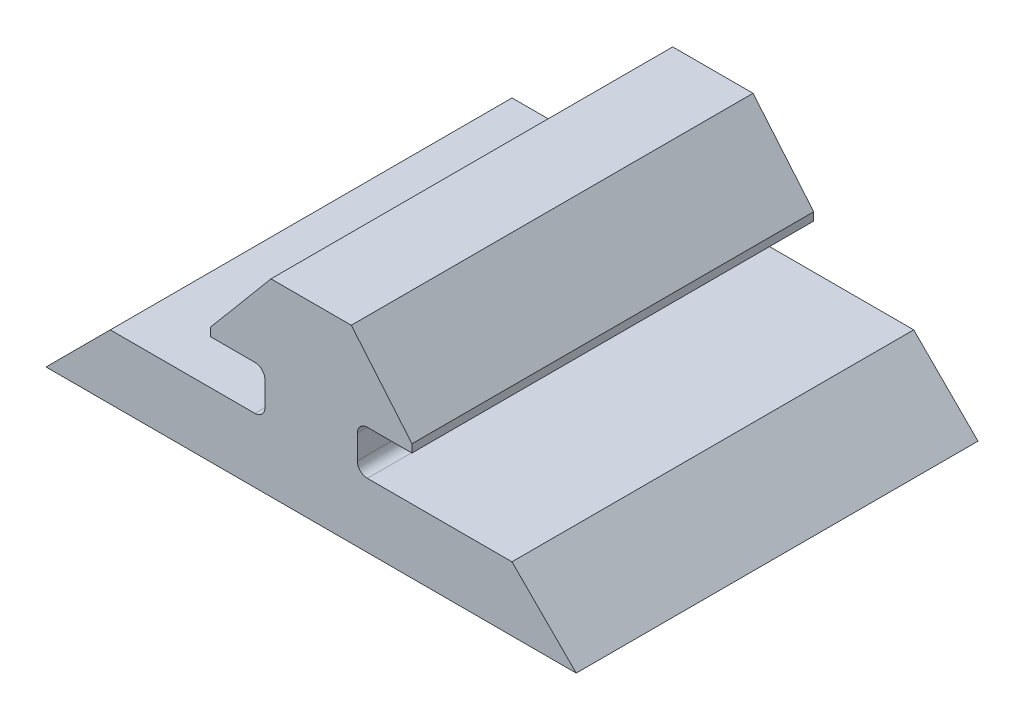
ISO-10303-21;
HEADER;
FILE_DESCRIPTION(('STEP AP214'),'2;1');
FILE_NAME('part.step','',(''),(''),'','','');
FILE_SCHEMA(('AUTOMOTIVE_DESIGN { 1 0 10303 214 1 1 1 1 }'));
ENDSEC;
DATA;
#1=APPLICATION_CONTEXT('core data for automotive mechanical design processes');
#2=APPLICATION_PROTOCOL_DEFINITION('international standard','automotive_design',2000,#1);
#3=PRODUCT_CONTEXT('',#1,'mechanical');
#4=PRODUCT('Part','Part','',(#3));
#5=PRODUCT_RELATED_PRODUCT_CATEGORY('part','',(#4));
#6=PRODUCT_DEFINITION_FORMATION('','',#4);
#7=PRODUCT_DEFINITION_CONTEXT('part definition',#1,'design');
#8=PRODUCT_DEFINITION('design','',#6,#7);
#9=PRODUCT_DEFINITION_SHAPE('','',#8);
#10=(LENGTH_UNIT() NAMED_UNIT(*) SI_UNIT(.MILLI.,.METRE.));
#11=(NAMED_UNIT(*) PLANE_ANGLE_UNIT() SI_UNIT($,.RADIAN.));
#12=(NAMED_UNIT(*) SI_UNIT($,.STERADIAN.) SOLID_ANGLE_UNIT());
#13=UNCERTAINTY_MEASURE_WITH_UNIT(LENGTH_MEASURE(1.E-05),#10,'distance_accuracy_value','');
#14=(GEOMETRIC_REPRESENTATION_CONTEXT(3) GLOBAL_UNCERTAINTY_ASSIGNED_CONTEXT((#13)) GLOBAL_UNIT_ASSIGNED_CONTEXT((#10,
#11,#12)) REPRESENTATION_CONTEXT('',''));
#15=CARTESIAN_POINT('',(0.,0.,0.));
#16=DIRECTION('',(0.,0.,1.));
#17=DIRECTION('',(1.,0.,0.));
#18=AXIS2_PLACEMENT_3D('',#15,#16,#17);
#19=CARTESIAN_POINT('',(12.7,0.,4.44089209850063E-13));
#20=DIRECTION('',(0.,-1.,0.));
#21=DIRECTION('',(0.,0.,-1.));
#22=AXIS2_PLACEMENT_3D('',#19,#20,#21);
#23=PLANE('',#22);
#24=DIRECTION('',(-1.,0.,0.));
#25=VECTOR('',#24,1.);
#26=CARTESIAN_POINT('',(12.7,0.,-25.4031625000229));
#27=LINE('',#26,#25);
#28=CARTESIAN_POINT('',(16.7640000000001,0.,-25.4031625000229));
#29=VERTEX_POINT('',#28);
#30=CARTESIAN_POINT('',(-16.7639999999999,0.,-25.4031625000229));
#31=VERTEX_POINT('',#30);
#32=EDGE_CURVE('E49',#29,#31,#27,.T.);
#33=ORIENTED_EDGE('',*,*,#32,.F.);
#34=DIRECTION('',(0.,0.,1.));
#35=VECTOR('',#34,1.);
#36=CARTESIAN_POINT('',(16.7640000000001,0.,-50.8000000000001));
#37=LINE('',#36,#35);
#38=CARTESIAN_POINT('',(16.7640000000001,0.,0.));
#39=VERTEX_POINT('',#38);
#40=EDGE_CURVE('E168',#29,#39,#37,.T.);
#41=ORIENTED_EDGE('',*,*,#40,.T.);
#42=DIRECTION('',(-1.,0.,0.));
#43=VECTOR('',#42,1.);
#44=CARTESIAN_POINT('',(12.7,0.,4.44089209850063E-13));
#45=LINE('',#44,#43);
#46=CARTESIAN_POINT('',(-16.7639999999999,0.,0.));
#47=VERTEX_POINT('',#46);
#48=EDGE_CURVE('E228',#39,#47,#45,.T.);
#49=ORIENTED_EDGE('',*,*,#48,.T.);
#50=DIRECTION('',(0.,0.,1.));
#51=VECTOR('',#50,1.);
#52=CARTESIAN_POINT('',(-16.7639999999999,0.,-50.8000000000001));
#53=LINE('',#52,#51);
#54=EDGE_CURVE('E170',#31,#47,#53,.T.);
#55=ORIENTED_EDGE('',*,*,#54,.F.);
#56=EDGE_LOOP('',(#33,#41,#49,#55));
#57=FACE_BOUND('',#56,.T.);
#58=ADVANCED_FACE('F35',(#57),#23,.T.);
#59=CARTESIAN_POINT('',(3.55599999999985,4.06399999999999,4.44089209850063E-13));
#60=DIRECTION('',(0.,1.,0.));
#61=DIRECTION('',(-1.,0.,0.));
#62=AXIS2_PLACEMENT_3D('',#59,#60,#61);
#63=PLANE('',#62);
#64=DIRECTION('',(1.,0.,0.));
#65=VECTOR('',#64,1.);
#66=CARTESIAN_POINT('',(3.55599999999985,4.06399999999999,-25.4031625000229));
#67=LINE('',#66,#65);
#68=CARTESIAN_POINT('',(3.55599999999985,4.06399999999999,-25.4031625000229));
#69=VERTEX_POINT('',#68);
#70=CARTESIAN_POINT('',(12.7,4.064,-25.4031625000229));
#71=VERTEX_POINT('',#70);
#72=EDGE_CURVE('E160',#69,#71,#67,.T.);
#73=ORIENTED_EDGE('',*,*,#72,.F.);
#74=DIRECTION('',(0.,0.,-1.));
#75=VECTOR('',#74,1.);
#76=CARTESIAN_POINT('',(3.55599999999985,4.064,4.44089209850063E-13));
#77=LINE('',#76,#75);
#78=CARTESIAN_POINT('',(3.55599999999985,4.064,4.44089209850063E-13));
#79=VERTEX_POINT('',#78);
#80=EDGE_CURVE('E43',#79,#69,#77,.T.);
#81=ORIENTED_EDGE('',*,*,#80,.F.);
#82=DIRECTION('',(1.,0.,0.));
#83=VECTOR('',#82,1.);
#84=CARTESIAN_POINT('',(3.55599999999985,4.06399999999999,4.44089209850063E-13));
#85=LINE('',#84,#83);
#86=CARTESIAN_POINT('',(12.7,4.064,0.));
#87=VERTEX_POINT('',#86);
#88=EDGE_CURVE('E226',#79,#87,#85,.T.);
#89=ORIENTED_EDGE('',*,*,#88,.T.);
#90=DIRECTION('',(0.,0.,1.));
#91=VECTOR('',#90,1.);
#92=CARTESIAN_POINT('',(12.7,4.064,-50.8000000000001));
#93=LINE('',#92,#91);
#94=EDGE_CURVE('E177',#71,#87,#93,.T.);
#95=ORIENTED_EDGE('',*,*,#94,.F.);
#96=EDGE_LOOP('',(#73,#81,#89,#95));
#97=FACE_BOUND('',#96,.T.);
#98=ADVANCED_FACE('F361',(#97),#63,.T.);
#99=CARTESIAN_POINT('',(3.55599999999985,4.69899999999985,4.44089209850063E-13));
#100=DIRECTION('',(0.,0.,-1.));
#101=DIRECTION('',(-1.,0.,0.));
#102=AXIS2_PLACEMENT_3D('',#99,#100,#101);
#103=CYLINDRICAL_SURFACE('',#102,0.634999999999851);
#104=CARTESIAN_POINT('',(3.55599999999985,4.69899999999985,-25.4031625000229));
#105=DIRECTION('',(0.,0.,1.));
#106=DIRECTION('',(1.,0.,0.));
#107=AXIS2_PLACEMENT_3D('',#104,#105,#106);
#108=CIRCLE('',#107,0.634999999999851);
#109=CARTESIAN_POINT('',(2.921,4.69899999999985,-25.4031625000229));
#110=VERTEX_POINT('',#109);
#111=EDGE_CURVE('E303',#110,#69,#108,.T.);
#112=ORIENTED_EDGE('',*,*,#111,.F.);
#113=DIRECTION('',(0.,0.,-1.));
#114=VECTOR('',#113,1.);
#115=CARTESIAN_POINT('',(2.921,4.69899999999985,4.44089209850063E-13));
#116=LINE('',#115,#114);
#117=CARTESIAN_POINT('',(2.921,4.69899999999985,4.44089209850063E-13));
#118=VERTEX_POINT('',#117);
#119=EDGE_CURVE('E232',#118,#110,#116,.T.);
#120=ORIENTED_EDGE('',*,*,#119,.F.);
#121=CARTESIAN_POINT('',(3.55599999999985,4.69899999999985,4.44089209850063E-13));
#122=DIRECTION('',(0.,0.,1.));
#123=DIRECTION('',(1.,0.,0.));
#124=AXIS2_PLACEMENT_3D('',#121,#122,#123);
#125=CIRCLE('',#124,0.634999999999851);
#126=EDGE_CURVE('E223',#118,#79,#125,.T.);
#127=ORIENTED_EDGE('',*,*,#126,.T.);
#128=ORIENTED_EDGE('',*,*,#80,.T.);
#129=EDGE_LOOP('',(#112,#120,#127,#128));
#130=FACE_BOUND('',#129,.T.);
#131=ADVANCED_FACE('F322',(#130),#103,.F.);
#132=CARTESIAN_POINT('',(2.92099999999999,6.22300000000015,4.44089209850063E-13));
#133=DIRECTION('',(1.,0.,0.));
#134=DIRECTION('',(0.,1.,0.));
#135=AXIS2_PLACEMENT_3D('',#132,#133,#134);
#136=PLANE('',#135);
#137=DIRECTION('',(0.,-1.,0.));
#138=VECTOR('',#137,1.);
#139=CARTESIAN_POINT('',(2.92099999999999,6.22300000000015,-25.4031625000229));
#140=LINE('',#139,#138);
#141=CARTESIAN_POINT('',(2.92099999999999,6.22300000000015,-25.4031625000229));
#142=VERTEX_POINT('',#141);
#143=EDGE_CURVE('E305',#142,#110,#140,.T.);
#144=ORIENTED_EDGE('',*,*,#143,.F.);
#145=DIRECTION('',(0.,0.,-1.));
#146=VECTOR('',#145,1.);
#147=CARTESIAN_POINT('',(2.921,6.22300000000015,4.44089209850063E-13));
#148=LINE('',#147,#146);
#149=CARTESIAN_POINT('',(2.921,6.22300000000015,4.44089209850063E-13));
#150=VERTEX_POINT('',#149);
#151=EDGE_CURVE('E235',#150,#142,#148,.T.);
#152=ORIENTED_EDGE('',*,*,#151,.F.);
#153=DIRECTION('',(0.,-1.,0.));
#154=VECTOR('',#153,1.);
#155=CARTESIAN_POINT('',(2.92099999999999,6.22300000000015,4.44089209850063E-13));
#156=LINE('',#155,#154);
#157=EDGE_CURVE('E220',#150,#118,#156,.T.);
#158=ORIENTED_EDGE('',*,*,#157,.T.);
#159=ORIENTED_EDGE('',*,*,#119,.T.);
#160=EDGE_LOOP('',(#144,#152,#158,#159));
#161=FACE_BOUND('',#160,.T.);
#162=ADVANCED_FACE('F325',(#161),#136,.T.);
#163=CARTESIAN_POINT('',(3.55599999999985,6.22300000000015,4.44089209850063E-13));
#164=DIRECTION('',(0.,0.,-1.));
#165=DIRECTION('',(-1.,0.,0.));
#166=AXIS2_PLACEMENT_3D('',#163,#164,#165);
#167=CYLINDRICAL_SURFACE('',#166,0.634999999999851);
#168=CARTESIAN_POINT('',(3.55599999999985,6.22300000000015,-25.4031625000229));
#169=DIRECTION('',(0.,0.,1.));
#170=DIRECTION('',(1.,0.,0.));
#171=AXIS2_PLACEMENT_3D('',#168,#169,#170);
#172=CIRCLE('',#171,0.634999999999851);
#173=CARTESIAN_POINT('',(3.55599999999985,6.858,-25.4031625000229));
#174=VERTEX_POINT('',#173);
#175=EDGE_CURVE('E307',#174,#142,#172,.T.);
#176=ORIENTED_EDGE('',*,*,#175,.F.);
#177=DIRECTION('',(0.,0.,-1.));
#178=VECTOR('',#177,1.);
#179=CARTESIAN_POINT('',(3.55599999999985,6.858,4.44089209850063E-13));
#180=LINE('',#179,#178);
#181=CARTESIAN_POINT('',(3.55599999999985,6.858,4.44089209850063E-13));
#182=VERTEX_POINT('',#181);
#183=EDGE_CURVE('E238',#182,#174,#180,.T.);
#184=ORIENTED_EDGE('',*,*,#183,.F.);
#185=CARTESIAN_POINT('',(3.55599999999985,6.22300000000015,4.44089209850063E-13));
#186=DIRECTION('',(0.,0.,1.));
#187=DIRECTION('',(1.,0.,0.));
#188=AXIS2_PLACEMENT_3D('',#185,#186,#187);
#189=CIRCLE('',#188,0.634999999999851);
#190=EDGE_CURVE('E217',#182,#150,#189,.T.);
#191=ORIENTED_EDGE('',*,*,#190,.T.);
#192=ORIENTED_EDGE('',*,*,#151,.T.);
#193=EDGE_LOOP('',(#176,#184,#191,#192));
#194=FACE_BOUND('',#193,.T.);
#195=ADVANCED_FACE('F330',(#194),#167,.F.);
#196=CARTESIAN_POINT('',(6.376363549,6.858,4.44089209850063E-13));
#197=DIRECTION('',(0.,-1.,0.));
#198=DIRECTION('',(0.,0.,-1.));
#199=AXIS2_PLACEMENT_3D('',#196,#197,#198);
#200=PLANE('',#199);
#201=DIRECTION('',(-1.,0.,0.));
#202=VECTOR('',#201,1.);
#203=CARTESIAN_POINT('',(6.376363549,6.858,-25.4031625000229));
#204=LINE('',#203,#202);
#205=CARTESIAN_POINT('',(6.376363549,6.858,-25.4031625000229));
#206=VERTEX_POINT('',#205);
#207=EDGE_CURVE('E309',#206,#174,#204,.T.);
#208=ORIENTED_EDGE('',*,*,#207,.F.);
#209=DIRECTION('',(0.,0.,-1.));
#210=VECTOR('',#209,1.);
#211=CARTESIAN_POINT('',(6.376363549,6.858,4.44089209850063E-13));
#212=LINE('',#211,#210);
#213=CARTESIAN_POINT('',(6.376363549,6.858,4.44089209850063E-13));
#214=VERTEX_POINT('',#213);
#215=EDGE_CURVE('E241',#214,#206,#212,.T.);
#216=ORIENTED_EDGE('',*,*,#215,.F.);
#217=DIRECTION('',(-1.,0.,0.));
#218=VECTOR('',#217,1.);
#219=CARTESIAN_POINT('',(6.376363549,6.858,4.44089209850063E-13));
#220=LINE('',#219,#218);
#221=EDGE_CURVE('E214',#214,#182,#220,.T.);
#222=ORIENTED_EDGE('',*,*,#221,.T.);
#223=ORIENTED_EDGE('',*,*,#183,.T.);
#224=EDGE_LOOP('',(#208,#216,#222,#223));
#225=FACE_BOUND('',#224,.T.);
#226=ADVANCED_FACE('F333',(#225),#200,.T.);
#227=CARTESIAN_POINT('',(6.376363549,7.36599995798179,4.44089209850063E-13));
#228=DIRECTION('',(1.,0.,0.));
#229=DIRECTION('',(0.,0.,-1.));
#230=AXIS2_PLACEMENT_3D('',#227,#228,#229);
#231=PLANE('',#230);
#232=DIRECTION('',(0.,-1.,0.));
#233=VECTOR('',#232,1.);
#234=CARTESIAN_POINT('',(6.376363549,7.36599995798179,-25.4031625000229));
#235=LINE('',#234,#233);
#236=CARTESIAN_POINT('',(6.376363549,7.36599995798179,-25.4031625000229));
#237=VERTEX_POINT('',#236);
#238=EDGE_CURVE('E311',#237,#206,#235,.T.);
#239=ORIENTED_EDGE('',*,*,#238,.F.);
#240=DIRECTION('',(0.,0.,-1.));
#241=VECTOR('',#240,1.);
#242=CARTESIAN_POINT('',(6.376363549,7.36599995798179,4.44089209850063E-13));
#243=LINE('',#242,#241);
#244=CARTESIAN_POINT('',(6.376363549,7.36599995798179,4.44089209850063E-13));
#245=VERTEX_POINT('',#244);
#246=EDGE_CURVE('E244',#245,#237,#243,.T.);
#247=ORIENTED_EDGE('',*,*,#246,.F.);
#248=DIRECTION('',(0.,-1.,0.));
#249=VECTOR('',#248,1.);
#250=CARTESIAN_POINT('',(6.376363549,7.36599995798179,4.44089209850063E-13));
#251=LINE('',#250,#249);
#252=EDGE_CURVE('E211',#245,#214,#251,.T.);
#253=ORIENTED_EDGE('',*,*,#252,.T.);
#254=ORIENTED_EDGE('',*,*,#215,.T.);
#255=EDGE_LOOP('',(#239,#247,#253,#254));
#256=FACE_BOUND('',#255,.T.);
#257=ADVANCED_FACE('F338',(#256),#231,.T.);
#258=CARTESIAN_POINT('',(2.54,11.938,4.44089209850063E-13));
#259=DIRECTION('',(0.766044443118977,0.642787609686541,0.));
#260=DIRECTION('',(-0.642787609686541,0.766044443118977,0.));
#261=AXIS2_PLACEMENT_3D('',#258,#259,#260);
#262=PLANE('',#261);
#263=DIRECTION('',(0.642787609686541,-0.766044443118977,0.));
#264=VECTOR('',#263,1.);
#265=CARTESIAN_POINT('',(2.54,11.938,-25.4031625000229));
#266=LINE('',#265,#264);
#267=CARTESIAN_POINT('',(2.54,11.938,-25.4031625000229));
#268=VERTEX_POINT('',#267);
#269=EDGE_CURVE('E313',#268,#237,#266,.T.);
#270=ORIENTED_EDGE('',*,*,#269,.F.);
#271=DIRECTION('',(0.,0.,-1.));
#272=VECTOR('',#271,1.);
#273=CARTESIAN_POINT('',(2.54,11.938,4.44089209850063E-13));
#274=LINE('',#273,#272);
#275=CARTESIAN_POINT('',(2.54,11.938,4.44089209850063E-13));
#276=VERTEX_POINT('',#275);
#277=EDGE_CURVE('E247',#276,#268,#274,.T.);
#278=ORIENTED_EDGE('',*,*,#277,.F.);
#279=DIRECTION('',(0.642787609686541,-0.766044443118977,0.));
#280=VECTOR('',#279,1.);
#281=CARTESIAN_POINT('',(2.54,11.938,4.44089209850063E-13));
#282=LINE('',#281,#280);
#283=EDGE_CURVE('E208',#276,#245,#282,.T.);
#284=ORIENTED_EDGE('',*,*,#283,.T.);
#285=ORIENTED_EDGE('',*,*,#246,.T.);
#286=EDGE_LOOP('',(#270,#278,#284,#285));
#287=FACE_BOUND('',#286,.T.);
#288=ADVANCED_FACE('F341',(#287),#262,.T.);
#289=CARTESIAN_POINT('',(-2.54,11.938,4.44089209850063E-13));
#290=DIRECTION('',(0.,1.,0.));
#291=DIRECTION('',(0.,0.,1.));
#292=AXIS2_PLACEMENT_3D('',#289,#290,#291);
#293=PLANE('',#292);
#294=DIRECTION('',(-1.,0.,0.));
#295=VECTOR('',#294,1.);
#296=CARTESIAN_POINT('',(16.7640000000001,11.938,-25.4031625000229));
#297=LINE('',#296,#295);
#298=CARTESIAN_POINT('',(-2.54,11.938,-25.4031625000229));
#299=VERTEX_POINT('',#298);
#300=EDGE_CURVE('E347',#268,#299,#297,.T.);
#301=ORIENTED_EDGE('',*,*,#300,.T.);
#302=DIRECTION('',(0.,0.,-1.));
#303=VECTOR('',#302,1.);
#304=CARTESIAN_POINT('',(-2.54,11.938,4.44089209850063E-13));
#305=LINE('',#304,#303);
#306=CARTESIAN_POINT('',(-2.54,11.938,4.44089209850063E-13));
#307=VERTEX_POINT('',#306);
#308=EDGE_CURVE('E250',#307,#299,#305,.T.);
#309=ORIENTED_EDGE('',*,*,#308,.F.);
#310=DIRECTION('',(1.,0.,0.));
#311=VECTOR('',#310,1.);
#312=CARTESIAN_POINT('',(-2.54,11.938,4.44089209850063E-13));
#313=LINE('',#312,#311);
#314=EDGE_CURVE('E205',#307,#276,#313,.T.);
#315=ORIENTED_EDGE('',*,*,#314,.T.);
#316=ORIENTED_EDGE('',*,*,#277,.T.);
#317=EDGE_LOOP('',(#301,#309,#315,#316));
#318=FACE_BOUND('',#317,.T.);
#319=ADVANCED_FACE('F346',(#318),#293,.T.);
#320=CARTESIAN_POINT('',(-6.376363549,7.36599995798179,4.44089209850063E-13));
#321=DIRECTION('',(-0.766044443118977,0.642787609686541,0.));
#322=DIRECTION('',(-0.642787609686541,-0.766044443118977,0.));
#323=AXIS2_PLACEMENT_3D('',#320,#321,#322);
#324=PLANE('',#323);
#325=DIRECTION('',(0.642787609686541,0.766044443118977,0.));
#326=VECTOR('',#325,1.);
#327=CARTESIAN_POINT('',(-6.376363549,7.36599995798179,-25.4031625000229));
#328=LINE('',#327,#326);
#329=CARTESIAN_POINT('',(-6.376363549,7.36599995798179,-25.4031625000229));
#330=VERTEX_POINT('',#329);
#331=EDGE_CURVE('E171',#330,#299,#328,.T.);
#332=ORIENTED_EDGE('',*,*,#331,.F.);
#333=DIRECTION('',(0.,0.,-1.));
#334=VECTOR('',#333,1.);
#335=CARTESIAN_POINT('',(-6.376363549,7.36599995798179,4.44089209850063E-13));
#336=LINE('',#335,#334);
#337=CARTESIAN_POINT('',(-6.376363549,7.36599995798179,4.44089209850063E-13));
#338=VERTEX_POINT('',#337);
#339=EDGE_CURVE('E253',#338,#330,#336,.T.);
#340=ORIENTED_EDGE('',*,*,#339,.F.);
#341=DIRECTION('',(0.642787609686541,0.766044443118977,0.));
#342=VECTOR('',#341,1.);
#343=CARTESIAN_POINT('',(-6.376363549,7.36599995798179,4.44089209850063E-13));
#344=LINE('',#343,#342);
#345=EDGE_CURVE('E202',#338,#307,#344,.T.);
#346=ORIENTED_EDGE('',*,*,#345,.T.);
#347=ORIENTED_EDGE('',*,*,#308,.T.);
#348=EDGE_LOOP('',(#332,#340,#346,#347));
#349=FACE_BOUND('',#348,.T.);
#350=ADVANCED_FACE('F350',(#349),#324,.T.);
#351=CARTESIAN_POINT('',(-6.376363549,6.858,4.44089209850063E-13));
#352=DIRECTION('',(-1.,0.,0.));
#353=DIRECTION('',(0.,0.,1.));
#354=AXIS2_PLACEMENT_3D('',#351,#352,#353);
#355=PLANE('',#354);
#356=DIRECTION('',(0.,1.,0.));
#357=VECTOR('',#356,1.);
#358=CARTESIAN_POINT('',(-6.376363549,6.858,-25.4031625000229));
#359=LINE('',#358,#357);
#360=CARTESIAN_POINT('',(-6.376363549,6.858,-25.4031625000229));
#361=VERTEX_POINT('',#360);
#362=EDGE_CURVE('E299',#361,#330,#359,.T.);
#363=ORIENTED_EDGE('',*,*,#362,.F.);
#364=DIRECTION('',(0.,0.,-1.));
#365=VECTOR('',#364,1.);
#366=CARTESIAN_POINT('',(-6.376363549,6.858,4.44089209850063E-13));
#367=LINE('',#366,#365);
#368=CARTESIAN_POINT('',(-6.376363549,6.858,4.44089209850063E-13));
#369=VERTEX_POINT('',#368);
#370=EDGE_CURVE('E256',#369,#361,#367,.T.);
#371=ORIENTED_EDGE('',*,*,#370,.F.);
#372=DIRECTION('',(0.,1.,0.));
#373=VECTOR('',#372,1.);
#374=CARTESIAN_POINT('',(-6.376363549,6.858,4.44089209850063E-13));
#375=LINE('',#374,#373);
#376=EDGE_CURVE('E199',#369,#338,#375,.T.);
#377=ORIENTED_EDGE('',*,*,#376,.T.);
#378=ORIENTED_EDGE('',*,*,#339,.T.);
#379=EDGE_LOOP('',(#363,#371,#377,#378));
#380=FACE_BOUND('',#379,.T.);
#381=ADVANCED_FACE('F354',(#380),#355,.T.);
#382=CARTESIAN_POINT('',(-3.55599999999985,6.85800000000001,4.44089209850063E-13));
#383=DIRECTION('',(0.,-1.,0.));
#384=DIRECTION('',(1.,0.,0.));
#385=AXIS2_PLACEMENT_3D('',#382,#383,#384);
#386=PLANE('',#385);
#387=DIRECTION('',(-1.,0.,0.));
#388=VECTOR('',#387,1.);
#389=CARTESIAN_POINT('',(-3.55599999999985,6.85800000000001,-25.4031625000229));
#390=LINE('',#389,#388);
#391=CARTESIAN_POINT('',(-3.55599999999985,6.858,-25.4031625000229));
#392=VERTEX_POINT('',#391);
#393=EDGE_CURVE('E293',#392,#361,#390,.T.);
#394=ORIENTED_EDGE('',*,*,#393,.F.);
#395=DIRECTION('',(0.,0.,-1.));
#396=VECTOR('',#395,1.);
#397=CARTESIAN_POINT('',(-3.55599999999985,6.858,4.44089209850063E-13));
#398=LINE('',#397,#396);
#399=CARTESIAN_POINT('',(-3.55599999999985,6.858,4.44089209850063E-13));
#400=VERTEX_POINT('',#399);
#401=EDGE_CURVE('E259',#400,#392,#398,.T.);
#402=ORIENTED_EDGE('',*,*,#401,.F.);
#403=DIRECTION('',(-1.,0.,0.));
#404=VECTOR('',#403,1.);
#405=CARTESIAN_POINT('',(-3.55599999999985,6.85800000000001,4.44089209850063E-13));
#406=LINE('',#405,#404);
#407=EDGE_CURVE('E196',#400,#369,#406,.T.);
#408=ORIENTED_EDGE('',*,*,#407,.T.);
#409=ORIENTED_EDGE('',*,*,#370,.T.);
#410=EDGE_LOOP('',(#394,#402,#408,#409));
#411=FACE_BOUND('',#410,.T.);
#412=ADVANCED_FACE('F357',(#411),#386,.T.);
#413=CARTESIAN_POINT('',(-3.55599999999985,6.22300000000015,4.44089209850063E-13));
#414=DIRECTION('',(0.,0.,-1.));
#415=DIRECTION('',(-1.,0.,0.));
#416=AXIS2_PLACEMENT_3D('',#413,#414,#415);
#417=CYLINDRICAL_SURFACE('',#416,0.634999999999851);
#418=CARTESIAN_POINT('',(-3.55599999999985,6.22300000000015,-25.4031625000229));
#419=DIRECTION('',(0.,0.,1.));
#420=DIRECTION('',(1.,0.,0.));
#421=AXIS2_PLACEMENT_3D('',#418,#419,#420);
#422=CIRCLE('',#421,0.634999999999851);
#423=CARTESIAN_POINT('',(-2.921,6.22300000000015,-25.4031625000229));
#424=VERTEX_POINT('',#423);
#425=EDGE_CURVE('E291',#424,#392,#422,.T.);
#426=ORIENTED_EDGE('',*,*,#425,.F.);
#427=DIRECTION('',(0.,0.,-1.));
#428=VECTOR('',#427,1.);
#429=CARTESIAN_POINT('',(-2.921,6.22300000000015,4.44089209850063E-13));
#430=LINE('',#429,#428);
#431=CARTESIAN_POINT('',(-2.921,6.22300000000015,4.44089209850063E-13));
#432=VERTEX_POINT('',#431);
#433=EDGE_CURVE('E262',#432,#424,#430,.T.);
#434=ORIENTED_EDGE('',*,*,#433,.F.);
#435=CARTESIAN_POINT('',(-3.55599999999985,6.22300000000015,4.44089209850063E-13));
#436=DIRECTION('',(0.,0.,1.));
#437=DIRECTION('',(1.,0.,0.));
#438=AXIS2_PLACEMENT_3D('',#435,#436,#437);
#439=CIRCLE('',#438,0.634999999999851);
#440=EDGE_CURVE('E193',#432,#400,#439,.T.);
#441=ORIENTED_EDGE('',*,*,#440,.T.);
#442=ORIENTED_EDGE('',*,*,#401,.T.);
#443=EDGE_LOOP('',(#426,#434,#441,#442));
#444=FACE_BOUND('',#443,.T.);
#445=ADVANCED_FACE('F359',(#444),#417,.F.);
#446=CARTESIAN_POINT('',(-2.92099999999999,4.69899999999985,4.44089209850063E-13));
#447=DIRECTION('',(-1.,0.,0.));
#448=DIRECTION('',(0.,-1.,0.));
#449=AXIS2_PLACEMENT_3D('',#446,#447,#448);
#450=PLANE('',#449);
#451=DIRECTION('',(0.,1.,0.));
#452=VECTOR('',#451,1.);
#453=CARTESIAN_POINT('',(-2.92099999999999,4.69899999999985,-25.4031625000229));
#454=LINE('',#453,#452);
#455=CARTESIAN_POINT('',(-2.921,4.69899999999985,-25.4031625000229));
#456=VERTEX_POINT('',#455);
#457=EDGE_CURVE('E289',#456,#424,#454,.T.);
#458=ORIENTED_EDGE('',*,*,#457,.F.);
#459=DIRECTION('',(0.,0.,-1.));
#460=VECTOR('',#459,1.);
#461=CARTESIAN_POINT('',(-2.921,4.69899999999985,4.44089209850063E-13));
#462=LINE('',#461,#460);
#463=CARTESIAN_POINT('',(-2.921,4.69899999999985,4.44089209850063E-13));
#464=VERTEX_POINT('',#463);
#465=EDGE_CURVE('E265',#464,#456,#462,.T.);
#466=ORIENTED_EDGE('',*,*,#465,.F.);
#467=DIRECTION('',(0.,1.,0.));
#468=VECTOR('',#467,1.);
#469=CARTESIAN_POINT('',(-2.92099999999999,4.69899999999985,4.44089209850063E-13));
#470=LINE('',#469,#468);
#471=EDGE_CURVE('E190',#464,#432,#470,.T.);
#472=ORIENTED_EDGE('',*,*,#471,.T.);
#473=ORIENTED_EDGE('',*,*,#433,.T.);
#474=EDGE_LOOP('',(#458,#466,#472,#473));
#475=FACE_BOUND('',#474,.T.);
#476=ADVANCED_FACE('F288',(#475),#450,.T.);
#477=CARTESIAN_POINT('',(-3.55599999999985,4.69899999999985,4.44089209850063E-13));
#478=DIRECTION('',(0.,0.,-1.));
#479=DIRECTION('',(-1.,0.,0.));
#480=AXIS2_PLACEMENT_3D('',#477,#478,#479);
#481=CYLINDRICAL_SURFACE('',#480,0.634999999999851);
#482=CARTESIAN_POINT('',(-3.55599999999985,4.69899999999985,-25.4031625000229));
#483=DIRECTION('',(0.,0.,1.));
#484=DIRECTION('',(1.,0.,0.));
#485=AXIS2_PLACEMENT_3D('',#482,#483,#484);
#486=CIRCLE('',#485,0.634999999999851);
#487=CARTESIAN_POINT('',(-3.55599999999985,4.064,-25.4031625000229));
#488=VERTEX_POINT('',#487);
#489=EDGE_CURVE('E278',#488,#456,#486,.T.);
#490=ORIENTED_EDGE('',*,*,#489,.F.);
#491=DIRECTION('',(0.,0.,-1.));
#492=VECTOR('',#491,1.);
#493=CARTESIAN_POINT('',(-3.55599999999985,4.064,4.44089209850063E-13));
#494=LINE('',#493,#492);
#495=CARTESIAN_POINT('',(-3.55599999999985,4.064,4.44089209850063E-13));
#496=VERTEX_POINT('',#495);
#497=EDGE_CURVE('E230',#496,#488,#494,.T.);
#498=ORIENTED_EDGE('',*,*,#497,.F.);
#499=CARTESIAN_POINT('',(-3.55599999999985,4.69899999999985,4.44089209850063E-13));
#500=DIRECTION('',(0.,0.,1.));
#501=DIRECTION('',(1.,0.,0.));
#502=AXIS2_PLACEMENT_3D('',#499,#500,#501);
#503=CIRCLE('',#502,0.634999999999851);
#504=EDGE_CURVE('E187',#496,#464,#503,.T.);
#505=ORIENTED_EDGE('',*,*,#504,.T.);
#506=ORIENTED_EDGE('',*,*,#465,.T.);
#507=EDGE_LOOP('',(#490,#498,#505,#506));
#508=FACE_BOUND('',#507,.T.);
#509=ADVANCED_FACE('F277',(#508),#481,.F.);
#510=CARTESIAN_POINT('',(-12.7,4.064,4.44089209850063E-13));
#511=DIRECTION('',(0.,1.,0.));
#512=DIRECTION('',(0.,0.,1.));
#513=AXIS2_PLACEMENT_3D('',#510,#511,#512);
#514=PLANE('',#513);
#515=DIRECTION('',(1.,0.,0.));
#516=VECTOR('',#515,1.);
#517=CARTESIAN_POINT('',(-12.7,4.064,-25.4031625000229));
#518=LINE('',#517,#516);
#519=CARTESIAN_POINT('',(-12.7,4.064,-25.4031625000229));
#520=VERTEX_POINT('',#519);
#521=EDGE_CURVE('E271',#520,#488,#518,.T.);
#522=ORIENTED_EDGE('',*,*,#521,.F.);
#523=DIRECTION('',(0.,0.,1.));
#524=VECTOR('',#523,1.);
#525=CARTESIAN_POINT('',(-12.7,4.064,-50.8000000000001));
#526=LINE('',#525,#524);
#527=CARTESIAN_POINT('',(-12.7,4.064,0.));
#528=VERTEX_POINT('',#527);
#529=EDGE_CURVE('E179',#520,#528,#526,.T.);
#530=ORIENTED_EDGE('',*,*,#529,.T.);
#531=DIRECTION('',(1.,0.,0.));
#532=VECTOR('',#531,1.);
#533=CARTESIAN_POINT('',(-12.7,4.064,4.44089209850063E-13));
#534=LINE('',#533,#532);
#535=EDGE_CURVE('E185',#528,#496,#534,.T.);
#536=ORIENTED_EDGE('',*,*,#535,.T.);
#537=ORIENTED_EDGE('',*,*,#497,.T.);
#538=EDGE_LOOP('',(#522,#530,#536,#537));
#539=FACE_BOUND('',#538,.T.);
#540=ADVANCED_FACE('F37',(#539),#514,.T.);
#541=CARTESIAN_POINT('',(-3.55599999999985,4.69899999999985,4.44089209850063E-13));
#542=DIRECTION('',(0.,0.,1.));
#543=DIRECTION('',(1.,0.,0.));
#544=AXIS2_PLACEMENT_3D('',#541,#542,#543);
#545=PLANE('',#544);
#546=ORIENTED_EDGE('',*,*,#48,.F.);
#547=DIRECTION('',(-0.707106781186556,0.707106781186539,0.));
#548=VECTOR('',#547,1.);
#549=CARTESIAN_POINT('',(12.7,4.064,0.));
#550=LINE('',#549,#548);
#551=EDGE_CURVE('E176',#39,#87,#550,.T.);
#552=ORIENTED_EDGE('',*,*,#551,.T.);
#553=ORIENTED_EDGE('',*,*,#88,.F.);
#554=ORIENTED_EDGE('',*,*,#126,.F.);
#555=ORIENTED_EDGE('',*,*,#157,.F.);
#556=ORIENTED_EDGE('',*,*,#190,.F.);
#557=ORIENTED_EDGE('',*,*,#221,.F.);
#558=ORIENTED_EDGE('',*,*,#252,.F.);
#559=ORIENTED_EDGE('',*,*,#283,.F.);
#560=ORIENTED_EDGE('',*,*,#314,.F.);
#561=ORIENTED_EDGE('',*,*,#345,.F.);
#562=ORIENTED_EDGE('',*,*,#376,.F.);
#563=ORIENTED_EDGE('',*,*,#407,.F.);
#564=ORIENTED_EDGE('',*,*,#440,.F.);
#565=ORIENTED_EDGE('',*,*,#471,.F.);
#566=ORIENTED_EDGE('',*,*,#504,.F.);
#567=ORIENTED_EDGE('',*,*,#535,.F.);
#568=DIRECTION('',(-0.707106781186541,-0.707106781186554,0.));
#569=VECTOR('',#568,1.);
#570=CARTESIAN_POINT('',(-12.7,4.064,0.));
#571=LINE('',#570,#569);
#572=EDGE_CURVE('E315',#528,#47,#571,.T.);
#573=ORIENTED_EDGE('',*,*,#572,.T.);
#574=EDGE_LOOP('',(#546,#552,#553,#554,#555,#556,#557,#558,#559,#560,#561,#562,#563,#564,#565,
#566,#567,#573));
#575=FACE_BOUND('',#574,.T.);
#576=ADVANCED_FACE('F281',(#575),#545,.T.);
#577=CARTESIAN_POINT('',(12.7,4.064,-50.8000000000001));
#578=DIRECTION('',(0.707106781186539,0.707106781186556,0.));
#579=DIRECTION('',(-0.707106781186556,0.707106781186539,0.));
#580=AXIS2_PLACEMENT_3D('',#577,#578,#579);
#581=PLANE('',#580);
#582=DIRECTION('',(0.707106781186556,-0.707106781186539,0.));
#583=VECTOR('',#582,1.);
#584=CARTESIAN_POINT('',(12.7,4.064,-25.4031625000229));
#585=LINE('',#584,#583);
#586=EDGE_CURVE('E158',#71,#29,#585,.T.);
#587=ORIENTED_EDGE('',*,*,#586,.F.);
#588=ORIENTED_EDGE('',*,*,#94,.T.);
#589=ORIENTED_EDGE('',*,*,#551,.F.);
#590=ORIENTED_EDGE('',*,*,#40,.F.);
#591=EDGE_LOOP('',(#587,#588,#589,#590));
#592=FACE_BOUND('',#591,.T.);
#593=ADVANCED_FACE('F174',(#592),#581,.T.);
#594=CARTESIAN_POINT('',(-12.7,4.064,-50.8000000000001));
#595=DIRECTION('',(-0.707106781186554,0.707106781186541,0.));
#596=DIRECTION('',(-0.707106781186541,-0.707106781186554,0.));
#597=AXIS2_PLACEMENT_3D('',#594,#595,#596);
#598=PLANE('',#597);
#599=DIRECTION('',(0.707106781186541,0.707106781186554,0.));
#600=VECTOR('',#599,1.);
#601=CARTESIAN_POINT('',(-12.7,4.064,-25.4031625000229));
#602=LINE('',#601,#600);
#603=EDGE_CURVE('E11',#31,#520,#602,.T.);
#604=ORIENTED_EDGE('',*,*,#603,.F.);
#605=ORIENTED_EDGE('',*,*,#54,.T.);
#606=ORIENTED_EDGE('',*,*,#572,.F.);
#607=ORIENTED_EDGE('',*,*,#529,.F.);
#608=EDGE_LOOP('',(#604,#605,#606,#607));
#609=FACE_BOUND('',#608,.T.);
#610=ADVANCED_FACE('F317',(#609),#598,.T.);
#611=CARTESIAN_POINT('',(16.7640000000001,11.938,-25.4031625000229));
#612=DIRECTION('',(0.,0.,1.));
#613=DIRECTION('',(1.,0.,0.));
#614=AXIS2_PLACEMENT_3D('',#611,#612,#613);
#615=PLANE('',#614);
#616=ORIENTED_EDGE('',*,*,#269,.T.);
#617=ORIENTED_EDGE('',*,*,#238,.T.);
#618=ORIENTED_EDGE('',*,*,#207,.T.);
#619=ORIENTED_EDGE('',*,*,#175,.T.);
#620=ORIENTED_EDGE('',*,*,#143,.T.);
#621=ORIENTED_EDGE('',*,*,#111,.T.);
#622=ORIENTED_EDGE('',*,*,#72,.T.);
#623=ORIENTED_EDGE('',*,*,#586,.T.);
#624=ORIENTED_EDGE('',*,*,#32,.T.);
#625=ORIENTED_EDGE('',*,*,#603,.T.);
#626=ORIENTED_EDGE('',*,*,#521,.T.);
#627=ORIENTED_EDGE('',*,*,#489,.T.);
#628=ORIENTED_EDGE('',*,*,#457,.T.);
#629=ORIENTED_EDGE('',*,*,#425,.T.);
#630=ORIENTED_EDGE('',*,*,#393,.T.);
#631=ORIENTED_EDGE('',*,*,#362,.T.);
#632=ORIENTED_EDGE('',*,*,#331,.T.);
#633=ORIENTED_EDGE('',*,*,#300,.F.);
#634=EDGE_LOOP('',(#616,#617,#618,#619,#620,#621,#622,#623,#624,#625,#626,#627,#628,#629,#630,
#631,#632,#633));
#635=FACE_BOUND('',#634,.T.);
#636=ADVANCED_FACE('F159',(#635),#615,.F.);
#637=CLOSED_SHELL('',(#58,#98,#131,#162,#195,#226,#257,#288,#319,#350,#381,#412,#445,#476,#509,
#540,#576,#593,#610,#636));
#638=MANIFOLD_SOLID_BREP('B2',#637);
#639=ADVANCED_BREP_SHAPE_REPRESENTATION('',(#18,#638),#14);
#640=SHAPE_DEFINITION_REPRESENTATION(#9,#639);
ENDSEC;
END-ISO-10303-21;
